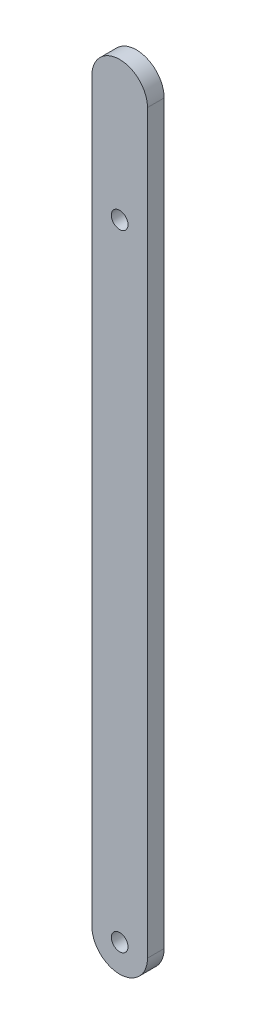
ISO-10303-21;
HEADER;
FILE_DESCRIPTION(('STEP AP214'),'2;1');
FILE_NAME('part.step','',(''),(''),'','','');
FILE_SCHEMA(('AUTOMOTIVE_DESIGN { 1 0 10303 214 1 1 1 1 }'));
ENDSEC;
DATA;
#1=APPLICATION_CONTEXT('core data for automotive mechanical design processes');
#2=APPLICATION_PROTOCOL_DEFINITION('international standard','automotive_design',2000,#1);
#3=PRODUCT_CONTEXT('',#1,'mechanical');
#4=PRODUCT('Part','Part','',(#3));
#5=PRODUCT_RELATED_PRODUCT_CATEGORY('part','',(#4));
#6=PRODUCT_DEFINITION_FORMATION('','',#4);
#7=PRODUCT_DEFINITION_CONTEXT('part definition',#1,'design');
#8=PRODUCT_DEFINITION('design','',#6,#7);
#9=PRODUCT_DEFINITION_SHAPE('','',#8);
#10=(LENGTH_UNIT() NAMED_UNIT(*) SI_UNIT(.MILLI.,.METRE.));
#11=(NAMED_UNIT(*) PLANE_ANGLE_UNIT() SI_UNIT($,.RADIAN.));
#12=(NAMED_UNIT(*) SI_UNIT($,.STERADIAN.) SOLID_ANGLE_UNIT());
#13=UNCERTAINTY_MEASURE_WITH_UNIT(LENGTH_MEASURE(1.E-05),#10,'distance_accuracy_value','');
#14=(GEOMETRIC_REPRESENTATION_CONTEXT(3) GLOBAL_UNCERTAINTY_ASSIGNED_CONTEXT((#13)) GLOBAL_UNIT_ASSIGNED_CONTEXT((#10,
#11,#12)) REPRESENTATION_CONTEXT('',''));
#15=CARTESIAN_POINT('',(0.,0.,0.));
#16=DIRECTION('',(0.,0.,1.));
#17=DIRECTION('',(1.,0.,0.));
#18=AXIS2_PLACEMENT_3D('',#15,#16,#17);
#19=CARTESIAN_POINT('',(0.,0.,6.));
#20=DIRECTION('',(0.,0.,-1.));
#21=DIRECTION('',(-1.,0.,0.));
#22=AXIS2_PLACEMENT_3D('',#19,#20,#21);
#23=CYLINDRICAL_SURFACE('',#22,10.);
#24=CARTESIAN_POINT('',(0.,0.,0.));
#25=DIRECTION('',(0.,0.,1.));
#26=DIRECTION('',(1.,0.,0.));
#27=AXIS2_PLACEMENT_3D('',#24,#25,#26);
#28=CIRCLE('',#27,10.);
#29=CARTESIAN_POINT('',(-10.,0.,0.));
#30=VERTEX_POINT('',#29);
#31=CARTESIAN_POINT('',(10.,0.,0.));
#32=VERTEX_POINT('',#31);
#33=EDGE_CURVE('E106',#30,#32,#28,.T.);
#34=ORIENTED_EDGE('',*,*,#33,.T.);
#35=DIRECTION('',(0.,0.,-1.));
#36=VECTOR('',#35,1.);
#37=CARTESIAN_POINT('',(10.,0.,6.));
#38=LINE('',#37,#36);
#39=CARTESIAN_POINT('',(10.,0.,6.));
#40=VERTEX_POINT('',#39);
#41=EDGE_CURVE('E11',#40,#32,#38,.T.);
#42=ORIENTED_EDGE('',*,*,#41,.F.);
#43=CARTESIAN_POINT('',(0.,0.,6.));
#44=DIRECTION('',(0.,0.,1.));
#45=DIRECTION('',(1.,0.,0.));
#46=AXIS2_PLACEMENT_3D('',#43,#44,#45);
#47=CIRCLE('',#46,10.);
#48=CARTESIAN_POINT('',(-10.,0.,6.));
#49=VERTEX_POINT('',#48);
#50=EDGE_CURVE('E109',#49,#40,#47,.T.);
#51=ORIENTED_EDGE('',*,*,#50,.F.);
#52=DIRECTION('',(0.,0.,-1.));
#53=VECTOR('',#52,1.);
#54=CARTESIAN_POINT('',(-10.,0.,6.));
#55=LINE('',#54,#53);
#56=EDGE_CURVE('E41',#49,#30,#55,.T.);
#57=ORIENTED_EDGE('',*,*,#56,.T.);
#58=EDGE_LOOP('',(#34,#42,#51,#57));
#59=FACE_BOUND('',#58,.T.);
#60=ADVANCED_FACE('F33',(#59),#23,.T.);
#61=CARTESIAN_POINT('',(10.,0.,6.));
#62=DIRECTION('',(-1.,0.,0.));
#63=DIRECTION('',(0.,0.,1.));
#64=AXIS2_PLACEMENT_3D('',#61,#62,#63);
#65=PLANE('',#64);
#66=DIRECTION('',(0.,1.,0.));
#67=VECTOR('',#66,1.);
#68=CARTESIAN_POINT('',(10.,0.,0.));
#69=LINE('',#68,#67);
#70=CARTESIAN_POINT('',(10.,265.,0.));
#71=VERTEX_POINT('',#70);
#72=EDGE_CURVE('E61',#32,#71,#69,.T.);
#73=ORIENTED_EDGE('',*,*,#72,.T.);
#74=DIRECTION('',(0.,0.,1.));
#75=VECTOR('',#74,1.);
#76=CARTESIAN_POINT('',(10.,265.,0.));
#77=LINE('',#76,#75);
#78=CARTESIAN_POINT('',(10.,265.,6.));
#79=VERTEX_POINT('',#78);
#80=EDGE_CURVE('E89',#71,#79,#77,.T.);
#81=ORIENTED_EDGE('',*,*,#80,.T.);
#82=DIRECTION('',(0.,1.,0.));
#83=VECTOR('',#82,1.);
#84=CARTESIAN_POINT('',(10.,0.,6.));
#85=LINE('',#84,#83);
#86=EDGE_CURVE('E80',#40,#79,#85,.T.);
#87=ORIENTED_EDGE('',*,*,#86,.F.);
#88=ORIENTED_EDGE('',*,*,#41,.T.);
#89=EDGE_LOOP('',(#73,#81,#87,#88));
#90=FACE_BOUND('',#89,.T.);
#91=ADVANCED_FACE('F135',(#90),#65,.F.);
#92=CARTESIAN_POINT('',(-10.,0.,6.));
#93=DIRECTION('',(1.,0.,0.));
#94=DIRECTION('',(0.,0.,-1.));
#95=AXIS2_PLACEMENT_3D('',#92,#93,#94);
#96=PLANE('',#95);
#97=DIRECTION('',(0.,-1.,0.));
#98=VECTOR('',#97,1.);
#99=CARTESIAN_POINT('',(-10.,0.,0.));
#100=LINE('',#99,#98);
#101=CARTESIAN_POINT('',(-10.,265.,0.));
#102=VERTEX_POINT('',#101);
#103=EDGE_CURVE('E66',#102,#30,#100,.T.);
#104=ORIENTED_EDGE('',*,*,#103,.T.);
#105=ORIENTED_EDGE('',*,*,#56,.F.);
#106=DIRECTION('',(0.,-1.,0.));
#107=VECTOR('',#106,1.);
#108=CARTESIAN_POINT('',(-10.,0.,6.));
#109=LINE('',#108,#107);
#110=CARTESIAN_POINT('',(-10.,265.,6.));
#111=VERTEX_POINT('',#110);
#112=EDGE_CURVE('E49',#111,#49,#109,.T.);
#113=ORIENTED_EDGE('',*,*,#112,.F.);
#114=DIRECTION('',(0.,0.,1.));
#115=VECTOR('',#114,1.);
#116=CARTESIAN_POINT('',(-10.,265.,0.));
#117=LINE('',#116,#115);
#118=EDGE_CURVE('E76',#102,#111,#117,.T.);
#119=ORIENTED_EDGE('',*,*,#118,.F.);
#120=EDGE_LOOP('',(#104,#105,#113,#119));
#121=FACE_BOUND('',#120,.T.);
#122=ADVANCED_FACE('F75',(#121),#96,.F.);
#123=CARTESIAN_POINT('',(0.,0.,6.));
#124=DIRECTION('',(0.,0.,1.));
#125=DIRECTION('',(1.,0.,0.));
#126=AXIS2_PLACEMENT_3D('',#123,#124,#125);
#127=PLANE('',#126);
#128=CARTESIAN_POINT('',(0.,0.,6.));
#129=DIRECTION('',(0.,0.,1.));
#130=DIRECTION('',(1.,0.,0.));
#131=AXIS2_PLACEMENT_3D('',#128,#129,#130);
#132=CIRCLE('',#131,3.);
#133=CARTESIAN_POINT('',(3.,0.,6.));
#134=VERTEX_POINT('',#133);
#135=EDGE_CURVE('E88',#134,#134,#132,.T.);
#136=ORIENTED_EDGE('',*,*,#135,.F.);
#137=EDGE_LOOP('',(#136));
#138=FACE_BOUND('',#137,.T.);
#139=CARTESIAN_POINT('',(0.,225.,6.));
#140=DIRECTION('',(0.,0.,1.));
#141=DIRECTION('',(1.,0.,0.));
#142=AXIS2_PLACEMENT_3D('',#139,#140,#141);
#143=CIRCLE('',#142,3.);
#144=CARTESIAN_POINT('',(3.,225.,6.));
#145=VERTEX_POINT('',#144);
#146=EDGE_CURVE('E100',#145,#145,#143,.T.);
#147=ORIENTED_EDGE('',*,*,#146,.F.);
#148=EDGE_LOOP('',(#147));
#149=FACE_BOUND('',#148,.T.);
#150=ORIENTED_EDGE('',*,*,#50,.T.);
#151=ORIENTED_EDGE('',*,*,#86,.T.);
#152=CARTESIAN_POINT('',(0.,265.,6.));
#153=DIRECTION('',(0.,0.,1.));
#154=DIRECTION('',(1.,0.,0.));
#155=AXIS2_PLACEMENT_3D('',#152,#153,#154);
#156=CIRCLE('',#155,10.);
#157=EDGE_CURVE('E86',#79,#111,#156,.T.);
#158=ORIENTED_EDGE('',*,*,#157,.T.);
#159=ORIENTED_EDGE('',*,*,#112,.T.);
#160=EDGE_LOOP('',(#150,#151,#158,#159));
#161=FACE_BOUND('',#160,.T.);
#162=ADVANCED_FACE('F91',(#138,#149,#161),#127,.T.);
#163=CARTESIAN_POINT('',(0.,0.,0.));
#164=DIRECTION('',(0.,0.,1.));
#165=DIRECTION('',(1.,0.,0.));
#166=AXIS2_PLACEMENT_3D('',#163,#164,#165);
#167=PLANE('',#166);
#168=CARTESIAN_POINT('',(0.,0.,0.));
#169=DIRECTION('',(0.,0.,1.));
#170=DIRECTION('',(1.,0.,0.));
#171=AXIS2_PLACEMENT_3D('',#168,#169,#170);
#172=CIRCLE('',#171,3.);
#173=CARTESIAN_POINT('',(3.,0.,0.));
#174=VERTEX_POINT('',#173);
#175=EDGE_CURVE('E97',#174,#174,#172,.T.);
#176=ORIENTED_EDGE('',*,*,#175,.T.);
#177=EDGE_LOOP('',(#176));
#178=FACE_BOUND('',#177,.T.);
#179=CARTESIAN_POINT('',(0.,225.,0.));
#180=DIRECTION('',(0.,0.,1.));
#181=DIRECTION('',(1.,0.,0.));
#182=AXIS2_PLACEMENT_3D('',#179,#180,#181);
#183=CIRCLE('',#182,3.);
#184=CARTESIAN_POINT('',(3.,225.,0.));
#185=VERTEX_POINT('',#184);
#186=EDGE_CURVE('E103',#185,#185,#183,.T.);
#187=ORIENTED_EDGE('',*,*,#186,.T.);
#188=EDGE_LOOP('',(#187));
#189=FACE_BOUND('',#188,.T.);
#190=ORIENTED_EDGE('',*,*,#33,.F.);
#191=ORIENTED_EDGE('',*,*,#103,.F.);
#192=CARTESIAN_POINT('',(0.,265.,0.));
#193=DIRECTION('',(0.,0.,1.));
#194=DIRECTION('',(1.,0.,0.));
#195=AXIS2_PLACEMENT_3D('',#192,#193,#194);
#196=CIRCLE('',#195,10.);
#197=EDGE_CURVE('E87',#71,#102,#196,.T.);
#198=ORIENTED_EDGE('',*,*,#197,.F.);
#199=ORIENTED_EDGE('',*,*,#72,.F.);
#200=EDGE_LOOP('',(#190,#191,#198,#199));
#201=FACE_BOUND('',#200,.T.);
#202=ADVANCED_FACE('F117',(#178,#189,#201),#167,.F.);
#203=CARTESIAN_POINT('',(0.,225.,0.));
#204=DIRECTION('',(0.,0.,1.));
#205=DIRECTION('',(1.,0.,0.));
#206=AXIS2_PLACEMENT_3D('',#203,#204,#205);
#207=CYLINDRICAL_SURFACE('',#206,3.);
#208=ORIENTED_EDGE('',*,*,#186,.F.);
#209=EDGE_LOOP('',(#208));
#210=FACE_BOUND('',#209,.T.);
#211=ORIENTED_EDGE('',*,*,#146,.T.);
#212=EDGE_LOOP('',(#211));
#213=FACE_BOUND('',#212,.T.);
#214=ADVANCED_FACE('F119',(#210,#213),#207,.F.);
#215=CARTESIAN_POINT('',(0.,0.,0.));
#216=DIRECTION('',(0.,0.,1.));
#217=DIRECTION('',(1.,0.,0.));
#218=AXIS2_PLACEMENT_3D('',#215,#216,#217);
#219=CYLINDRICAL_SURFACE('',#218,3.);
#220=ORIENTED_EDGE('',*,*,#175,.F.);
#221=EDGE_LOOP('',(#220));
#222=FACE_BOUND('',#221,.T.);
#223=ORIENTED_EDGE('',*,*,#135,.T.);
#224=EDGE_LOOP('',(#223));
#225=FACE_BOUND('',#224,.T.);
#226=ADVANCED_FACE('F127',(#222,#225),#219,.F.);
#227=CARTESIAN_POINT('',(0.,265.,0.));
#228=DIRECTION('',(0.,0.,1.));
#229=DIRECTION('',(1.,0.,0.));
#230=AXIS2_PLACEMENT_3D('',#227,#228,#229);
#231=CYLINDRICAL_SURFACE('',#230,10.);
#232=ORIENTED_EDGE('',*,*,#157,.F.);
#233=ORIENTED_EDGE('',*,*,#80,.F.);
#234=ORIENTED_EDGE('',*,*,#197,.T.);
#235=ORIENTED_EDGE('',*,*,#118,.T.);
#236=EDGE_LOOP('',(#232,#233,#234,#235));
#237=FACE_BOUND('',#236,.T.);
#238=ADVANCED_FACE('F84',(#237),#231,.T.);
#239=CLOSED_SHELL('',(#60,#91,#122,#162,#202,#214,#226,#238));
#240=MANIFOLD_SOLID_BREP('B2',#239);
#241=ADVANCED_BREP_SHAPE_REPRESENTATION('',(#18,#240),#14);
#242=SHAPE_DEFINITION_REPRESENTATION(#9,#241);
ENDSEC;
END-ISO-10303-21;
